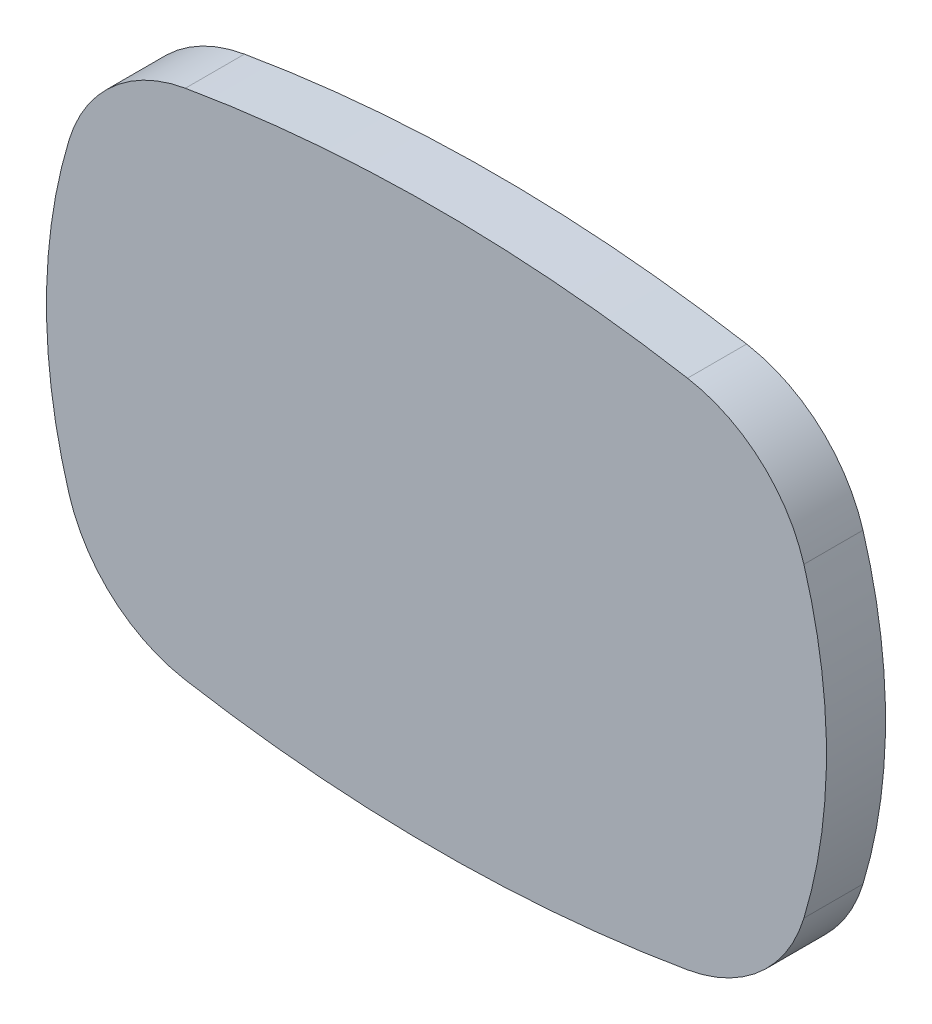
ISO-10303-21;
HEADER;
FILE_DESCRIPTION(('STEP AP214'),'2;1');
FILE_NAME('part.step','',(''),(''),'','','');
FILE_SCHEMA(('AUTOMOTIVE_DESIGN { 1 0 10303 214 1 1 1 1 }'));
ENDSEC;
DATA;
#1=APPLICATION_CONTEXT('core data for automotive mechanical design processes');
#2=APPLICATION_PROTOCOL_DEFINITION('international standard','automotive_design',2000,#1);
#3=PRODUCT_CONTEXT('',#1,'mechanical');
#4=PRODUCT('Part','Part','',(#3));
#5=PRODUCT_RELATED_PRODUCT_CATEGORY('part','',(#4));
#6=PRODUCT_DEFINITION_FORMATION('','',#4);
#7=PRODUCT_DEFINITION_CONTEXT('part definition',#1,'design');
#8=PRODUCT_DEFINITION('design','',#6,#7);
#9=PRODUCT_DEFINITION_SHAPE('','',#8);
#10=(LENGTH_UNIT() NAMED_UNIT(*) SI_UNIT(.MILLI.,.METRE.));
#11=(NAMED_UNIT(*) PLANE_ANGLE_UNIT() SI_UNIT($,.RADIAN.));
#12=(NAMED_UNIT(*) SI_UNIT($,.STERADIAN.) SOLID_ANGLE_UNIT());
#13=UNCERTAINTY_MEASURE_WITH_UNIT(LENGTH_MEASURE(1.E-05),#10,'distance_accuracy_value','');
#14=(GEOMETRIC_REPRESENTATION_CONTEXT(3) GLOBAL_UNCERTAINTY_ASSIGNED_CONTEXT((#13)) GLOBAL_UNIT_ASSIGNED_CONTEXT((#10,
#11,#12)) REPRESENTATION_CONTEXT('',''));
#15=CARTESIAN_POINT('',(0.,0.,0.));
#16=DIRECTION('',(0.,0.,1.));
#17=DIRECTION('',(1.,0.,0.));
#18=AXIS2_PLACEMENT_3D('',#15,#16,#17);
#19=CARTESIAN_POINT('',(38.2441973907525,13.2740850375465,10.));
#20=DIRECTION('',(0.,0.,-1.));
#21=DIRECTION('',(-1.,0.,0.));
#22=AXIS2_PLACEMENT_3D('',#19,#20,#21);
#23=CYLINDRICAL_SURFACE('',#22,25.);
#24=CARTESIAN_POINT('',(38.2441973907525,13.2740850375465,0.));
#25=DIRECTION('',(0.,0.,1.));
#26=DIRECTION('',(-1.,0.,0.));
#27=AXIS2_PLACEMENT_3D('',#24,#25,#26);
#28=CIRCLE('',#27,25.);
#29=CARTESIAN_POINT('',(42.4935526563918,-11.3621277360594,0.));
#30=VERTEX_POINT('',#29);
#31=CARTESIAN_POINT('',(62.1842733102727,6.07181005198753,0.));
#32=VERTEX_POINT('',#31);
#33=EDGE_CURVE('E131',#30,#32,#28,.T.);
#34=ORIENTED_EDGE('',*,*,#33,.T.);
#35=DIRECTION('',(0.,0.,-1.));
#36=VECTOR('',#35,1.);
#37=CARTESIAN_POINT('',(62.1842733102727,6.07181005198753,10.));
#38=LINE('',#37,#36);
#39=CARTESIAN_POINT('',(62.1842733102727,6.07181005198753,10.));
#40=VERTEX_POINT('',#39);
#41=EDGE_CURVE('E11',#40,#32,#38,.T.);
#42=ORIENTED_EDGE('',*,*,#41,.F.);
#43=CARTESIAN_POINT('',(38.2441973907525,13.2740850375465,10.));
#44=DIRECTION('',(0.,0.,1.));
#45=DIRECTION('',(-1.,0.,0.));
#46=AXIS2_PLACEMENT_3D('',#43,#44,#45);
#47=CIRCLE('',#46,25.);
#48=CARTESIAN_POINT('',(42.4935526563918,-11.3621277360594,10.));
#49=VERTEX_POINT('',#48);
#50=EDGE_CURVE('E145',#49,#40,#47,.T.);
#51=ORIENTED_EDGE('',*,*,#50,.F.);
#52=DIRECTION('',(0.,0.,-1.));
#53=VECTOR('',#52,1.);
#54=CARTESIAN_POINT('',(42.4935526563918,-11.3621277360594,10.));
#55=LINE('',#54,#53);
#56=EDGE_CURVE('E127',#49,#30,#55,.T.);
#57=ORIENTED_EDGE('',*,*,#56,.T.);
#58=EDGE_LOOP('',(#34,#42,#51,#57));
#59=FACE_BOUND('',#58,.T.);
#60=ADVANCED_FACE('F35',(#59),#23,.T.);
#61=CARTESIAN_POINT('',(-24.,32.,10.));
#62=DIRECTION('',(0.,0.,-1.));
#63=DIRECTION('',(-1.,0.,0.));
#64=AXIS2_PLACEMENT_3D('',#61,#62,#63);
#65=CYLINDRICAL_SURFACE('',#64,90.);
#66=CARTESIAN_POINT('',(-24.,32.,0.));
#67=DIRECTION('',(0.,0.,1.));
#68=DIRECTION('',(-1.,0.,0.));
#69=AXIS2_PLACEMENT_3D('',#66,#67,#68);
#70=CIRCLE('',#69,90.);
#71=CARTESIAN_POINT('',(62.1842733102727,57.9281899480125,0.));
#72=VERTEX_POINT('',#71);
#73=EDGE_CURVE('E134',#32,#72,#70,.T.);
#74=ORIENTED_EDGE('',*,*,#73,.T.);
#75=DIRECTION('',(0.,0.,-1.));
#76=VECTOR('',#75,1.);
#77=CARTESIAN_POINT('',(62.1842733102727,57.9281899480125,10.));
#78=LINE('',#77,#76);
#79=CARTESIAN_POINT('',(62.1842733102727,57.9281899480125,10.));
#80=VERTEX_POINT('',#79);
#81=EDGE_CURVE('E43',#80,#72,#78,.T.);
#82=ORIENTED_EDGE('',*,*,#81,.F.);
#83=CARTESIAN_POINT('',(-24.,32.,10.));
#84=DIRECTION('',(0.,0.,1.));
#85=DIRECTION('',(-1.,0.,0.));
#86=AXIS2_PLACEMENT_3D('',#83,#84,#85);
#87=CIRCLE('',#86,90.);
#88=EDGE_CURVE('E94',#40,#80,#87,.T.);
#89=ORIENTED_EDGE('',*,*,#88,.F.);
#90=ORIENTED_EDGE('',*,*,#41,.T.);
#91=EDGE_LOOP('',(#74,#82,#89,#90));
#92=FACE_BOUND('',#91,.T.);
#93=ADVANCED_FACE('F180',(#92),#65,.T.);
#94=CARTESIAN_POINT('',(38.2441973907525,50.7259149624535,10.));
#95=DIRECTION('',(0.,0.,-1.));
#96=DIRECTION('',(-1.,0.,0.));
#97=AXIS2_PLACEMENT_3D('',#94,#95,#96);
#98=CYLINDRICAL_SURFACE('',#97,25.);
#99=CARTESIAN_POINT('',(38.2441973907525,50.7259149624535,0.));
#100=DIRECTION('',(0.,0.,1.));
#101=DIRECTION('',(1.,0.,0.));
#102=AXIS2_PLACEMENT_3D('',#99,#100,#101);
#103=CIRCLE('',#102,25.);
#104=CARTESIAN_POINT('',(42.4935526563917,75.3621277360594,0.));
#105=VERTEX_POINT('',#104);
#106=EDGE_CURVE('E136',#72,#105,#103,.T.);
#107=ORIENTED_EDGE('',*,*,#106,.T.);
#108=DIRECTION('',(0.,0.,-1.));
#109=VECTOR('',#108,1.);
#110=CARTESIAN_POINT('',(42.4935526563917,75.3621277360594,10.));
#111=LINE('',#110,#109);
#112=CARTESIAN_POINT('',(42.4935526563917,75.3621277360594,10.));
#113=VERTEX_POINT('',#112);
#114=EDGE_CURVE('E152',#113,#105,#111,.T.);
#115=ORIENTED_EDGE('',*,*,#114,.F.);
#116=CARTESIAN_POINT('',(38.2441973907525,50.7259149624535,10.));
#117=DIRECTION('',(0.,0.,1.));
#118=DIRECTION('',(1.,0.,0.));
#119=AXIS2_PLACEMENT_3D('',#116,#117,#118);
#120=CIRCLE('',#119,25.);
#121=EDGE_CURVE('E160',#80,#113,#120,.T.);
#122=ORIENTED_EDGE('',*,*,#121,.F.);
#123=ORIENTED_EDGE('',*,*,#81,.T.);
#124=EDGE_LOOP('',(#107,#115,#122,#123));
#125=FACE_BOUND('',#124,.T.);
#126=ADVANCED_FACE('F158',(#125),#98,.T.);
#127=CARTESIAN_POINT('',(0.,-171.,10.));
#128=DIRECTION('',(0.,0.,-1.));
#129=DIRECTION('',(-1.,0.,0.));
#130=AXIS2_PLACEMENT_3D('',#127,#128,#129);
#131=CYLINDRICAL_SURFACE('',#130,250.);
#132=CARTESIAN_POINT('',(0.,-171.,0.));
#133=DIRECTION('',(0.,0.,1.));
#134=DIRECTION('',(-1.,0.,0.));
#135=AXIS2_PLACEMENT_3D('',#132,#133,#134);
#136=CIRCLE('',#135,250.);
#137=CARTESIAN_POINT('',(-42.4935526563917,75.3621277360594,0.));
#138=VERTEX_POINT('',#137);
#139=EDGE_CURVE('E138',#105,#138,#136,.T.);
#140=ORIENTED_EDGE('',*,*,#139,.T.);
#141=DIRECTION('',(0.,0.,-1.));
#142=VECTOR('',#141,1.);
#143=CARTESIAN_POINT('',(-42.4935526563917,75.3621277360594,10.));
#144=LINE('',#143,#142);
#145=CARTESIAN_POINT('',(-42.4935526563917,75.3621277360594,10.));
#146=VERTEX_POINT('',#145);
#147=EDGE_CURVE('E149',#146,#138,#144,.T.);
#148=ORIENTED_EDGE('',*,*,#147,.F.);
#149=CARTESIAN_POINT('',(0.,-171.,10.));
#150=DIRECTION('',(0.,0.,1.));
#151=DIRECTION('',(-1.,0.,0.));
#152=AXIS2_PLACEMENT_3D('',#149,#150,#151);
#153=CIRCLE('',#152,250.);
#154=EDGE_CURVE('E172',#113,#146,#153,.T.);
#155=ORIENTED_EDGE('',*,*,#154,.F.);
#156=ORIENTED_EDGE('',*,*,#114,.T.);
#157=EDGE_LOOP('',(#140,#148,#155,#156));
#158=FACE_BOUND('',#157,.T.);
#159=ADVANCED_FACE('F168',(#158),#131,.T.);
#160=CARTESIAN_POINT('',(-38.2441973907525,50.7259149624535,10.));
#161=DIRECTION('',(0.,0.,-1.));
#162=DIRECTION('',(-1.,0.,0.));
#163=AXIS2_PLACEMENT_3D('',#160,#161,#162);
#164=CYLINDRICAL_SURFACE('',#163,25.);
#165=CARTESIAN_POINT('',(-38.2441973907525,50.7259149624535,0.));
#166=DIRECTION('',(0.,0.,1.));
#167=DIRECTION('',(-1.,0.,0.));
#168=AXIS2_PLACEMENT_3D('',#165,#166,#167);
#169=CIRCLE('',#168,25.);
#170=CARTESIAN_POINT('',(-62.1842733102727,57.9281899480125,0.));
#171=VERTEX_POINT('',#170);
#172=EDGE_CURVE('E140',#138,#171,#169,.T.);
#173=ORIENTED_EDGE('',*,*,#172,.T.);
#174=DIRECTION('',(0.,0.,-1.));
#175=VECTOR('',#174,1.);
#176=CARTESIAN_POINT('',(-62.1842733102727,57.9281899480125,10.));
#177=LINE('',#176,#175);
#178=CARTESIAN_POINT('',(-62.1842733102727,57.9281899480125,10.));
#179=VERTEX_POINT('',#178);
#180=EDGE_CURVE('E122',#179,#171,#177,.T.);
#181=ORIENTED_EDGE('',*,*,#180,.F.);
#182=CARTESIAN_POINT('',(-38.2441973907525,50.7259149624535,10.));
#183=DIRECTION('',(0.,0.,1.));
#184=DIRECTION('',(-1.,0.,0.));
#185=AXIS2_PLACEMENT_3D('',#182,#183,#184);
#186=CIRCLE('',#185,25.);
#187=EDGE_CURVE('E113',#146,#179,#186,.T.);
#188=ORIENTED_EDGE('',*,*,#187,.F.);
#189=ORIENTED_EDGE('',*,*,#147,.T.);
#190=EDGE_LOOP('',(#173,#181,#188,#189));
#191=FACE_BOUND('',#190,.T.);
#192=ADVANCED_FACE('F171',(#191),#164,.T.);
#193=CARTESIAN_POINT('',(24.,32.,10.));
#194=DIRECTION('',(0.,0.,-1.));
#195=DIRECTION('',(-1.,0.,0.));
#196=AXIS2_PLACEMENT_3D('',#193,#194,#195);
#197=CYLINDRICAL_SURFACE('',#196,90.);
#198=CARTESIAN_POINT('',(24.,32.,0.));
#199=DIRECTION('',(0.,0.,1.));
#200=DIRECTION('',(-1.,0.,0.));
#201=AXIS2_PLACEMENT_3D('',#198,#199,#200);
#202=CIRCLE('',#201,90.);
#203=CARTESIAN_POINT('',(-62.1842733102727,6.07181005198747,0.));
#204=VERTEX_POINT('',#203);
#205=EDGE_CURVE('E121',#171,#204,#202,.T.);
#206=ORIENTED_EDGE('',*,*,#205,.T.);
#207=DIRECTION('',(0.,0.,-1.));
#208=VECTOR('',#207,1.);
#209=CARTESIAN_POINT('',(-62.1842733102727,6.07181005198747,10.));
#210=LINE('',#209,#208);
#211=CARTESIAN_POINT('',(-62.1842733102727,6.07181005198747,10.));
#212=VERTEX_POINT('',#211);
#213=EDGE_CURVE('E118',#212,#204,#210,.T.);
#214=ORIENTED_EDGE('',*,*,#213,.F.);
#215=CARTESIAN_POINT('',(24.,32.,10.));
#216=DIRECTION('',(0.,0.,1.));
#217=DIRECTION('',(-1.,0.,0.));
#218=AXIS2_PLACEMENT_3D('',#215,#216,#217);
#219=CIRCLE('',#218,90.);
#220=EDGE_CURVE('E107',#179,#212,#219,.T.);
#221=ORIENTED_EDGE('',*,*,#220,.F.);
#222=ORIENTED_EDGE('',*,*,#180,.T.);
#223=EDGE_LOOP('',(#206,#214,#221,#222));
#224=FACE_BOUND('',#223,.T.);
#225=ADVANCED_FACE('F119',(#224),#197,.T.);
#226=CARTESIAN_POINT('',(-38.2441973907525,13.2740850375465,10.));
#227=DIRECTION('',(0.,0.,-1.));
#228=DIRECTION('',(-1.,0.,0.));
#229=AXIS2_PLACEMENT_3D('',#226,#227,#228);
#230=CYLINDRICAL_SURFACE('',#229,25.);
#231=CARTESIAN_POINT('',(-38.2441973907525,13.2740850375465,0.));
#232=DIRECTION('',(0.,0.,1.));
#233=DIRECTION('',(-1.,0.,0.));
#234=AXIS2_PLACEMENT_3D('',#231,#232,#233);
#235=CIRCLE('',#234,25.);
#236=CARTESIAN_POINT('',(-42.4935526563917,-11.3621277360594,0.));
#237=VERTEX_POINT('',#236);
#238=EDGE_CURVE('E80',#204,#237,#235,.T.);
#239=ORIENTED_EDGE('',*,*,#238,.T.);
#240=DIRECTION('',(0.,0.,-1.));
#241=VECTOR('',#240,1.);
#242=CARTESIAN_POINT('',(-42.4935526563917,-11.3621277360594,10.));
#243=LINE('',#242,#241);
#244=CARTESIAN_POINT('',(-42.4935526563917,-11.3621277360594,10.));
#245=VERTEX_POINT('',#244);
#246=EDGE_CURVE('E123',#245,#237,#243,.T.);
#247=ORIENTED_EDGE('',*,*,#246,.F.);
#248=CARTESIAN_POINT('',(-38.2441973907525,13.2740850375465,10.));
#249=DIRECTION('',(0.,0.,1.));
#250=DIRECTION('',(-1.,0.,0.));
#251=AXIS2_PLACEMENT_3D('',#248,#249,#250);
#252=CIRCLE('',#251,25.);
#253=EDGE_CURVE('E111',#212,#245,#252,.T.);
#254=ORIENTED_EDGE('',*,*,#253,.F.);
#255=ORIENTED_EDGE('',*,*,#213,.T.);
#256=EDGE_LOOP('',(#239,#247,#254,#255));
#257=FACE_BOUND('',#256,.T.);
#258=ADVANCED_FACE('F125',(#257),#230,.T.);
#259=CARTESIAN_POINT('',(0.,235.,10.));
#260=DIRECTION('',(0.,0.,-1.));
#261=DIRECTION('',(-1.,0.,0.));
#262=AXIS2_PLACEMENT_3D('',#259,#260,#261);
#263=CYLINDRICAL_SURFACE('',#262,250.);
#264=CARTESIAN_POINT('',(0.,235.,0.));
#265=DIRECTION('',(0.,0.,1.));
#266=DIRECTION('',(-1.,0.,0.));
#267=AXIS2_PLACEMENT_3D('',#264,#265,#266);
#268=CIRCLE('',#267,250.);
#269=EDGE_CURVE('E86',#237,#30,#268,.T.);
#270=ORIENTED_EDGE('',*,*,#269,.T.);
#271=ORIENTED_EDGE('',*,*,#56,.F.);
#272=CARTESIAN_POINT('',(0.,235.,10.));
#273=DIRECTION('',(0.,0.,1.));
#274=DIRECTION('',(-1.,0.,0.));
#275=AXIS2_PLACEMENT_3D('',#272,#273,#274);
#276=CIRCLE('',#275,250.);
#277=EDGE_CURVE('E51',#245,#49,#276,.T.);
#278=ORIENTED_EDGE('',*,*,#277,.F.);
#279=ORIENTED_EDGE('',*,*,#246,.T.);
#280=EDGE_LOOP('',(#270,#271,#278,#279));
#281=FACE_BOUND('',#280,.T.);
#282=ADVANCED_FACE('F196',(#281),#263,.T.);
#283=CARTESIAN_POINT('',(19.1220986953762,124.137042518773,10.));
#284=DIRECTION('',(0.,0.,-1.));
#285=DIRECTION('',(-1.,0.,0.));
#286=AXIS2_PLACEMENT_3D('',#283,#284,#285);
#287=PLANE('',#286);
#288=ORIENTED_EDGE('',*,*,#50,.T.);
#289=ORIENTED_EDGE('',*,*,#88,.T.);
#290=ORIENTED_EDGE('',*,*,#121,.T.);
#291=ORIENTED_EDGE('',*,*,#154,.T.);
#292=ORIENTED_EDGE('',*,*,#187,.T.);
#293=ORIENTED_EDGE('',*,*,#220,.T.);
#294=ORIENTED_EDGE('',*,*,#253,.T.);
#295=ORIENTED_EDGE('',*,*,#277,.T.);
#296=EDGE_LOOP('',(#288,#289,#290,#291,#292,#293,#294,#295));
#297=FACE_BOUND('',#296,.T.);
#298=ADVANCED_FACE('F109',(#297),#287,.F.);
#299=CARTESIAN_POINT('',(19.1220986953762,124.137042518773,0.));
#300=DIRECTION('',(0.,0.,-1.));
#301=DIRECTION('',(-1.,0.,0.));
#302=AXIS2_PLACEMENT_3D('',#299,#300,#301);
#303=PLANE('',#302);
#304=ORIENTED_EDGE('',*,*,#33,.F.);
#305=ORIENTED_EDGE('',*,*,#269,.F.);
#306=ORIENTED_EDGE('',*,*,#238,.F.);
#307=ORIENTED_EDGE('',*,*,#205,.F.);
#308=ORIENTED_EDGE('',*,*,#172,.F.);
#309=ORIENTED_EDGE('',*,*,#139,.F.);
#310=ORIENTED_EDGE('',*,*,#106,.F.);
#311=ORIENTED_EDGE('',*,*,#73,.F.);
#312=EDGE_LOOP('',(#304,#305,#306,#307,#308,#309,#310,#311));
#313=FACE_BOUND('',#312,.T.);
#314=ADVANCED_FACE('F164',(#313),#303,.T.);
#315=CLOSED_SHELL('',(#60,#93,#126,#159,#192,#225,#258,#282,#298,#314));
#316=MANIFOLD_SOLID_BREP('B2',#315);
#317=ADVANCED_BREP_SHAPE_REPRESENTATION('',(#18,#316),#14);
#318=SHAPE_DEFINITION_REPRESENTATION(#9,#317);
ENDSEC;
END-ISO-10303-21;
